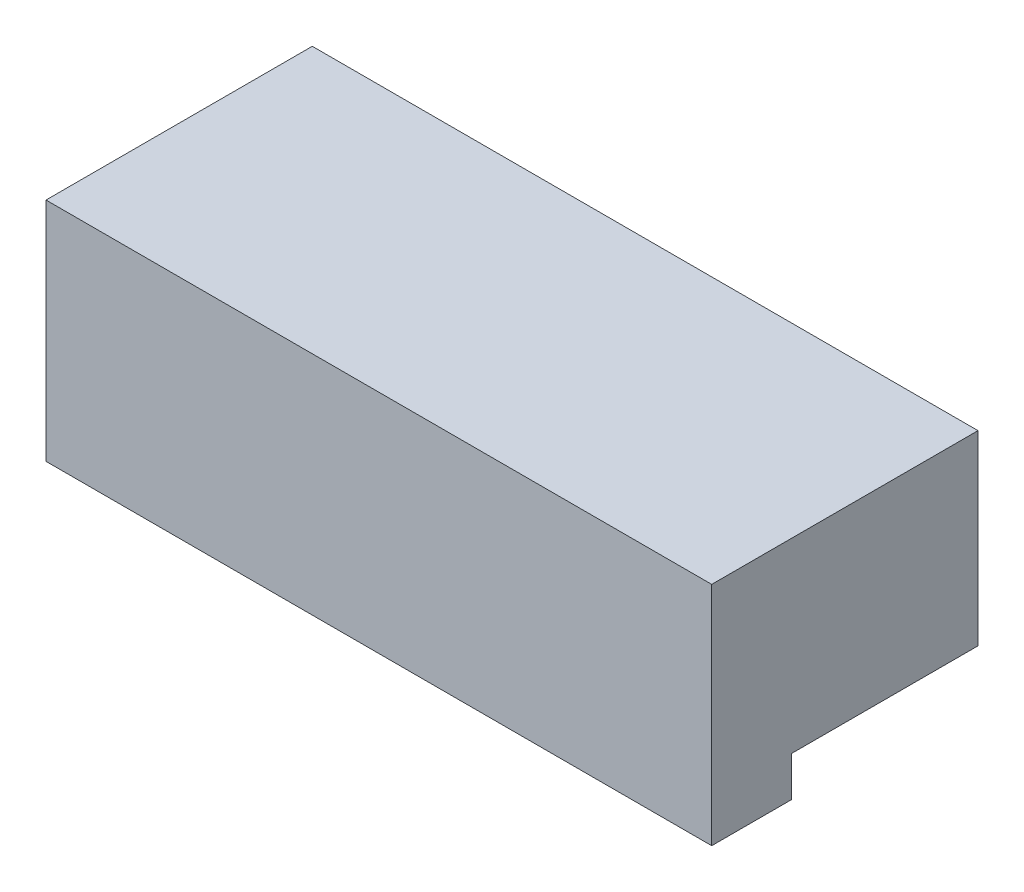
ISO-10303-21;
HEADER;
FILE_DESCRIPTION(('STEP AP214'),'2;1');
FILE_NAME('part.step','',(''),(''),'','','');
FILE_SCHEMA(('AUTOMOTIVE_DESIGN { 1 0 10303 214 1 1 1 1 }'));
ENDSEC;
DATA;
#1=APPLICATION_CONTEXT('core data for automotive mechanical design processes');
#2=APPLICATION_PROTOCOL_DEFINITION('international standard','automotive_design',2000,#1);
#3=PRODUCT_CONTEXT('',#1,'mechanical');
#4=PRODUCT('Part','Part','',(#3));
#5=PRODUCT_RELATED_PRODUCT_CATEGORY('part','',(#4));
#6=PRODUCT_DEFINITION_FORMATION('','',#4);
#7=PRODUCT_DEFINITION_CONTEXT('part definition',#1,'design');
#8=PRODUCT_DEFINITION('design','',#6,#7);
#9=PRODUCT_DEFINITION_SHAPE('','',#8);
#10=(LENGTH_UNIT() NAMED_UNIT(*) SI_UNIT(.MILLI.,.METRE.));
#11=(NAMED_UNIT(*) PLANE_ANGLE_UNIT() SI_UNIT($,.RADIAN.));
#12=(NAMED_UNIT(*) SI_UNIT($,.STERADIAN.) SOLID_ANGLE_UNIT());
#13=UNCERTAINTY_MEASURE_WITH_UNIT(LENGTH_MEASURE(1.E-05),#10,'distance_accuracy_value','');
#14=(GEOMETRIC_REPRESENTATION_CONTEXT(3) GLOBAL_UNCERTAINTY_ASSIGNED_CONTEXT((#13)) GLOBAL_UNIT_ASSIGNED_CONTEXT((#10,
#11,#12)) REPRESENTATION_CONTEXT('',''));
#15=CARTESIAN_POINT('',(0.,0.,0.));
#16=DIRECTION('',(0.,0.,1.));
#17=DIRECTION('',(1.,0.,0.));
#18=AXIS2_PLACEMENT_3D('',#15,#16,#17);
#19=CARTESIAN_POINT('',(-15.8070338737878,-7.59345794392523,10.));
#20=DIRECTION('',(0.,1.,0.));
#21=DIRECTION('',(0.,0.,1.));
#22=AXIS2_PLACEMENT_3D('',#19,#20,#21);
#23=PLANE('',#22);
#24=DIRECTION('',(1.,0.,0.));
#25=VECTOR('',#24,1.);
#26=CARTESIAN_POINT('',(-15.8070338737878,-7.59345794392523,7.));
#27=LINE('',#26,#25);
#28=CARTESIAN_POINT('',(-15.8070338737878,-7.59345794392523,7.));
#29=VERTEX_POINT('',#28);
#30=CARTESIAN_POINT('',(9.19296612621224,-7.59345794392523,7.));
#31=VERTEX_POINT('',#30);
#32=EDGE_CURVE('E54',#29,#31,#27,.T.);
#33=ORIENTED_EDGE('',*,*,#32,.F.);
#34=DIRECTION('',(0.,0.,-1.));
#35=VECTOR('',#34,1.);
#36=CARTESIAN_POINT('',(-15.8070338737878,-7.59345794392523,10.));
#37=LINE('',#36,#35);
#38=CARTESIAN_POINT('',(-15.8070338737878,-7.59345794392523,0.));
#39=VERTEX_POINT('',#38);
#40=EDGE_CURVE('E11',#29,#39,#37,.T.);
#41=ORIENTED_EDGE('',*,*,#40,.T.);
#42=DIRECTION('',(1.,0.,0.));
#43=VECTOR('',#42,1.);
#44=CARTESIAN_POINT('',(-15.8070338737878,-7.59345794392523,0.));
#45=LINE('',#44,#43);
#46=CARTESIAN_POINT('',(9.19296612621224,-7.59345794392523,0.));
#47=VERTEX_POINT('',#46);
#48=EDGE_CURVE('E104',#39,#47,#45,.T.);
#49=ORIENTED_EDGE('',*,*,#48,.T.);
#50=DIRECTION('',(0.,0.,-1.));
#51=VECTOR('',#50,1.);
#52=CARTESIAN_POINT('',(9.19296612621224,-7.59345794392523,10.));
#53=LINE('',#52,#51);
#54=EDGE_CURVE('E48',#31,#47,#53,.T.);
#55=ORIENTED_EDGE('',*,*,#54,.F.);
#56=EDGE_LOOP('',(#33,#41,#49,#55));
#57=FACE_BOUND('',#56,.T.);
#58=ADVANCED_FACE('F39',(#57),#23,.F.);
#59=CARTESIAN_POINT('',(-15.8070338737878,-0.59345794392523,10.));
#60=DIRECTION('',(1.,0.,0.));
#61=DIRECTION('',(0.,1.,0.));
#62=AXIS2_PLACEMENT_3D('',#59,#60,#61);
#63=PLANE('',#62);
#64=DIRECTION('',(0.,-1.,0.));
#65=VECTOR('',#64,1.);
#66=CARTESIAN_POINT('',(-15.8070338737878,-0.59345794392523,0.));
#67=LINE('',#66,#65);
#68=CARTESIAN_POINT('',(-15.8070338737878,-0.59345794392523,0.));
#69=VERTEX_POINT('',#68);
#70=EDGE_CURVE('E97',#69,#39,#67,.T.);
#71=ORIENTED_EDGE('',*,*,#70,.T.);
#72=ORIENTED_EDGE('',*,*,#40,.F.);
#73=DIRECTION('',(0.,1.,0.));
#74=VECTOR('',#73,1.);
#75=CARTESIAN_POINT('',(-15.8070338737878,-9.09345794392523,7.));
#76=LINE('',#75,#74);
#77=CARTESIAN_POINT('',(-15.8070338737878,-9.09345794392523,7.));
#78=VERTEX_POINT('',#77);
#79=EDGE_CURVE('E106',#78,#29,#76,.T.);
#80=ORIENTED_EDGE('',*,*,#79,.F.);
#81=DIRECTION('',(0.,0.,-1.));
#82=VECTOR('',#81,1.);
#83=CARTESIAN_POINT('',(-15.8070338737878,-9.09345794392523,10.));
#84=LINE('',#83,#82);
#85=CARTESIAN_POINT('',(-15.8070338737878,-9.09345794392523,10.));
#86=VERTEX_POINT('',#85);
#87=EDGE_CURVE('E141',#86,#78,#84,.T.);
#88=ORIENTED_EDGE('',*,*,#87,.F.);
#89=DIRECTION('',(0.,-1.,0.));
#90=VECTOR('',#89,1.);
#91=CARTESIAN_POINT('',(-15.8070338737878,-0.59345794392523,10.));
#92=LINE('',#91,#90);
#93=CARTESIAN_POINT('',(-15.8070338737878,-0.59345794392523,10.));
#94=VERTEX_POINT('',#93);
#95=EDGE_CURVE('E92',#94,#86,#92,.T.);
#96=ORIENTED_EDGE('',*,*,#95,.F.);
#97=DIRECTION('',(0.,0.,-1.));
#98=VECTOR('',#97,1.);
#99=CARTESIAN_POINT('',(-15.8070338737878,-0.59345794392523,10.));
#100=LINE('',#99,#98);
#101=EDGE_CURVE('E84',#94,#69,#100,.T.);
#102=ORIENTED_EDGE('',*,*,#101,.T.);
#103=EDGE_LOOP('',(#71,#72,#80,#88,#96,#102));
#104=FACE_BOUND('',#103,.T.);
#105=ADVANCED_FACE('F41',(#104),#63,.F.);
#106=CARTESIAN_POINT('',(9.19296612621223,-0.59345794392523,10.));
#107=DIRECTION('',(-1.,0.,0.));
#108=DIRECTION('',(0.,-1.,0.));
#109=AXIS2_PLACEMENT_3D('',#106,#107,#108);
#110=PLANE('',#109);
#111=DIRECTION('',(0.,1.,0.));
#112=VECTOR('',#111,1.);
#113=CARTESIAN_POINT('',(9.19296612621223,-0.59345794392523,0.));
#114=LINE('',#113,#112);
#115=CARTESIAN_POINT('',(9.19296612621223,-0.59345794392523,0.));
#116=VERTEX_POINT('',#115);
#117=EDGE_CURVE('E93',#47,#116,#114,.T.);
#118=ORIENTED_EDGE('',*,*,#117,.T.);
#119=DIRECTION('',(0.,0.,-1.));
#120=VECTOR('',#119,1.);
#121=CARTESIAN_POINT('',(9.19296612621223,-0.59345794392523,10.));
#122=LINE('',#121,#120);
#123=CARTESIAN_POINT('',(9.19296612621223,-0.59345794392523,10.));
#124=VERTEX_POINT('',#123);
#125=EDGE_CURVE('E87',#124,#116,#122,.T.);
#126=ORIENTED_EDGE('',*,*,#125,.F.);
#127=DIRECTION('',(0.,1.,0.));
#128=VECTOR('',#127,1.);
#129=CARTESIAN_POINT('',(9.19296612621223,-0.59345794392523,10.));
#130=LINE('',#129,#128);
#131=CARTESIAN_POINT('',(9.19296612621224,-9.09345794392523,10.));
#132=VERTEX_POINT('',#131);
#133=EDGE_CURVE('E159',#132,#124,#130,.T.);
#134=ORIENTED_EDGE('',*,*,#133,.F.);
#135=DIRECTION('',(0.,0.,1.));
#136=VECTOR('',#135,1.);
#137=CARTESIAN_POINT('',(9.19296612621224,-9.09345794392523,10.));
#138=LINE('',#137,#136);
#139=CARTESIAN_POINT('',(9.19296612621224,-9.09345794392523,7.));
#140=VERTEX_POINT('',#139);
#141=EDGE_CURVE('E140',#140,#132,#138,.T.);
#142=ORIENTED_EDGE('',*,*,#141,.F.);
#143=DIRECTION('',(0.,1.,0.));
#144=VECTOR('',#143,1.);
#145=CARTESIAN_POINT('',(9.19296612621224,-9.09345794392523,7.));
#146=LINE('',#145,#144);
#147=EDGE_CURVE('E112',#140,#31,#146,.T.);
#148=ORIENTED_EDGE('',*,*,#147,.T.);
#149=ORIENTED_EDGE('',*,*,#54,.T.);
#150=EDGE_LOOP('',(#118,#126,#134,#142,#148,#149));
#151=FACE_BOUND('',#150,.T.);
#152=ADVANCED_FACE('F123',(#151),#110,.F.);
#153=CARTESIAN_POINT('',(-15.8070338737878,-0.59345794392523,10.));
#154=DIRECTION('',(0.,-1.,0.));
#155=DIRECTION('',(0.,0.,-1.));
#156=AXIS2_PLACEMENT_3D('',#153,#154,#155);
#157=PLANE('',#156);
#158=DIRECTION('',(-1.,0.,0.));
#159=VECTOR('',#158,1.);
#160=CARTESIAN_POINT('',(-15.8070338737878,-0.59345794392523,0.));
#161=LINE('',#160,#159);
#162=EDGE_CURVE('E81',#116,#69,#161,.T.);
#163=ORIENTED_EDGE('',*,*,#162,.T.);
#164=ORIENTED_EDGE('',*,*,#101,.F.);
#165=DIRECTION('',(-1.,0.,0.));
#166=VECTOR('',#165,1.);
#167=CARTESIAN_POINT('',(-15.8070338737878,-0.59345794392523,10.));
#168=LINE('',#167,#166);
#169=EDGE_CURVE('E63',#124,#94,#168,.T.);
#170=ORIENTED_EDGE('',*,*,#169,.F.);
#171=ORIENTED_EDGE('',*,*,#125,.T.);
#172=EDGE_LOOP('',(#163,#164,#170,#171));
#173=FACE_BOUND('',#172,.T.);
#174=ADVANCED_FACE('F83',(#173),#157,.F.);
#175=CARTESIAN_POINT('',(0.,0.,10.));
#176=DIRECTION('',(0.,0.,1.));
#177=DIRECTION('',(1.,0.,0.));
#178=AXIS2_PLACEMENT_3D('',#175,#176,#177);
#179=PLANE('',#178);
#180=ORIENTED_EDGE('',*,*,#95,.T.);
#181=DIRECTION('',(-1.,0.,0.));
#182=VECTOR('',#181,1.);
#183=CARTESIAN_POINT('',(-15.8070338737878,-9.09345794392523,10.));
#184=LINE('',#183,#182);
#185=EDGE_CURVE('E146',#132,#86,#184,.T.);
#186=ORIENTED_EDGE('',*,*,#185,.F.);
#187=ORIENTED_EDGE('',*,*,#133,.T.);
#188=ORIENTED_EDGE('',*,*,#169,.T.);
#189=EDGE_LOOP('',(#180,#186,#187,#188));
#190=FACE_BOUND('',#189,.T.);
#191=ADVANCED_FACE('F163',(#190),#179,.T.);
#192=CARTESIAN_POINT('',(0.,0.,0.));
#193=DIRECTION('',(0.,0.,1.));
#194=DIRECTION('',(1.,0.,0.));
#195=AXIS2_PLACEMENT_3D('',#192,#193,#194);
#196=PLANE('',#195);
#197=ORIENTED_EDGE('',*,*,#70,.F.);
#198=ORIENTED_EDGE('',*,*,#162,.F.);
#199=ORIENTED_EDGE('',*,*,#117,.F.);
#200=ORIENTED_EDGE('',*,*,#48,.F.);
#201=EDGE_LOOP('',(#197,#198,#199,#200));
#202=FACE_BOUND('',#201,.T.);
#203=ADVANCED_FACE('F102',(#202),#196,.F.);
#204=CARTESIAN_POINT('',(-15.8070338737878,-9.09345794392523,7.));
#205=DIRECTION('',(0.,0.,1.));
#206=DIRECTION('',(1.,0.,0.));
#207=AXIS2_PLACEMENT_3D('',#204,#205,#206);
#208=PLANE('',#207);
#209=ORIENTED_EDGE('',*,*,#32,.T.);
#210=ORIENTED_EDGE('',*,*,#147,.F.);
#211=DIRECTION('',(1.,0.,0.));
#212=VECTOR('',#211,1.);
#213=CARTESIAN_POINT('',(-15.8070338737878,-9.09345794392523,7.));
#214=LINE('',#213,#212);
#215=EDGE_CURVE('E133',#78,#140,#214,.T.);
#216=ORIENTED_EDGE('',*,*,#215,.F.);
#217=ORIENTED_EDGE('',*,*,#79,.T.);
#218=EDGE_LOOP('',(#209,#210,#216,#217));
#219=FACE_BOUND('',#218,.T.);
#220=ADVANCED_FACE('F131',(#219),#208,.F.);
#221=CARTESIAN_POINT('',(0.,-9.09345794392523,0.));
#222=DIRECTION('',(0.,-1.,0.));
#223=DIRECTION('',(0.,0.,-1.));
#224=AXIS2_PLACEMENT_3D('',#221,#222,#223);
#225=PLANE('',#224);
#226=ORIENTED_EDGE('',*,*,#87,.T.);
#227=ORIENTED_EDGE('',*,*,#215,.T.);
#228=ORIENTED_EDGE('',*,*,#141,.T.);
#229=ORIENTED_EDGE('',*,*,#185,.T.);
#230=EDGE_LOOP('',(#226,#227,#228,#229));
#231=FACE_BOUND('',#230,.T.);
#232=ADVANCED_FACE('F144',(#231),#225,.T.);
#233=CLOSED_SHELL('',(#58,#105,#152,#174,#191,#203,#220,#232));
#234=MANIFOLD_SOLID_BREP('B2',#233);
#235=ADVANCED_BREP_SHAPE_REPRESENTATION('',(#18,#234),#14);
#236=SHAPE_DEFINITION_REPRESENTATION(#9,#235);
ENDSEC;
END-ISO-10303-21;
